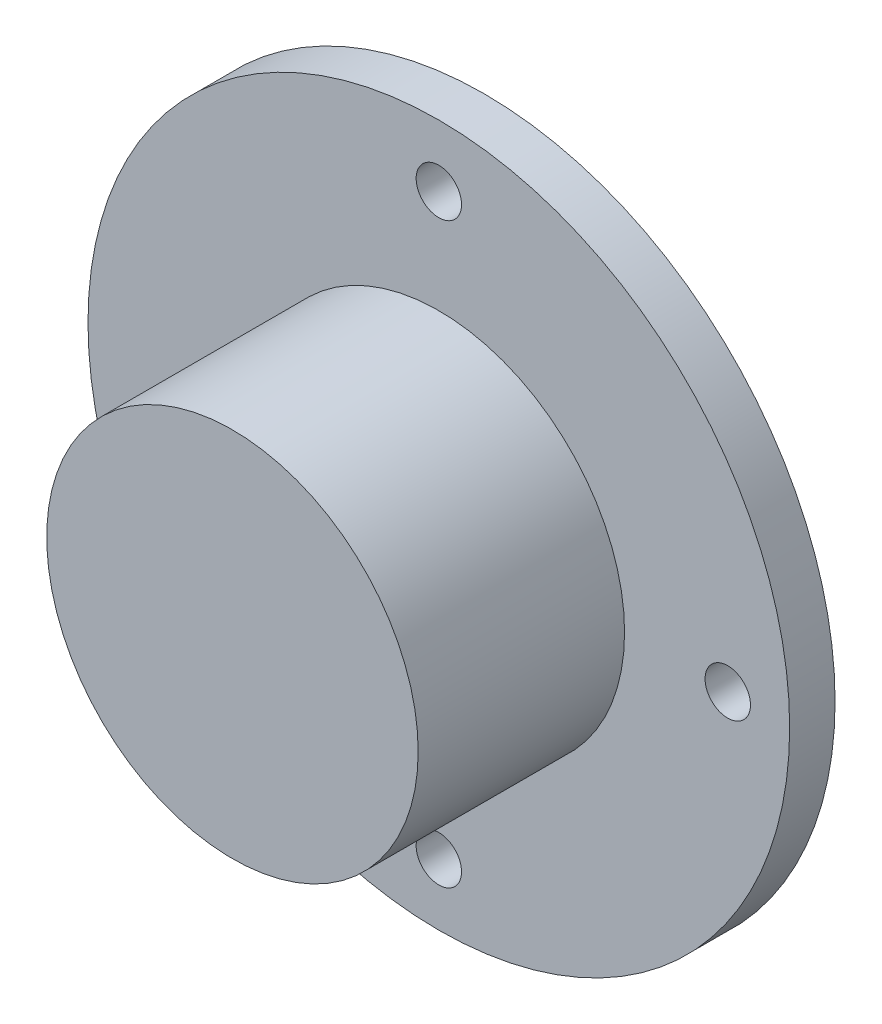
ISO-10303-21;
HEADER;
FILE_DESCRIPTION(('STEP AP214'),'2;1');
FILE_NAME('part.step','',(''),(''),'','','');
FILE_SCHEMA(('AUTOMOTIVE_DESIGN { 1 0 10303 214 1 1 1 1 }'));
ENDSEC;
DATA;
#1=APPLICATION_CONTEXT('core data for automotive mechanical design processes');
#2=APPLICATION_PROTOCOL_DEFINITION('international standard','automotive_design',2000,#1);
#3=PRODUCT_CONTEXT('',#1,'mechanical');
#4=PRODUCT('Part','Part','',(#3));
#5=PRODUCT_RELATED_PRODUCT_CATEGORY('part','',(#4));
#6=PRODUCT_DEFINITION_FORMATION('','',#4);
#7=PRODUCT_DEFINITION_CONTEXT('part definition',#1,'design');
#8=PRODUCT_DEFINITION('design','',#6,#7);
#9=PRODUCT_DEFINITION_SHAPE('','',#8);
#10=(LENGTH_UNIT() NAMED_UNIT(*) SI_UNIT(.MILLI.,.METRE.));
#11=(NAMED_UNIT(*) PLANE_ANGLE_UNIT() SI_UNIT($,.RADIAN.));
#12=(NAMED_UNIT(*) SI_UNIT($,.STERADIAN.) SOLID_ANGLE_UNIT());
#13=UNCERTAINTY_MEASURE_WITH_UNIT(LENGTH_MEASURE(1.E-05),#10,'distance_accuracy_value','');
#14=(GEOMETRIC_REPRESENTATION_CONTEXT(3) GLOBAL_UNCERTAINTY_ASSIGNED_CONTEXT((#13)) GLOBAL_UNIT_ASSIGNED_CONTEXT((#10,
#11,#12)) REPRESENTATION_CONTEXT('',''));
#15=CARTESIAN_POINT('',(0.,0.,0.));
#16=DIRECTION('',(0.,0.,1.));
#17=DIRECTION('',(1.,0.,0.));
#18=AXIS2_PLACEMENT_3D('',#15,#16,#17);
#19=CARTESIAN_POINT('',(0.,0.,2.));
#20=DIRECTION('',(0.,0.,-1.));
#21=DIRECTION('',(-1.,0.,0.));
#22=AXIS2_PLACEMENT_3D('',#19,#20,#21);
#23=CYLINDRICAL_SURFACE('',#22,17.);
#24=CARTESIAN_POINT('',(0.,0.,2.));
#25=DIRECTION('',(0.,0.,1.));
#26=DIRECTION('',(1.,0.,0.));
#27=AXIS2_PLACEMENT_3D('',#24,#25,#26);
#28=CIRCLE('',#27,17.);
#29=CARTESIAN_POINT('',(17.,0.,2.));
#30=VERTEX_POINT('',#29);
#31=EDGE_CURVE('E51',#30,#30,#28,.T.);
#32=ORIENTED_EDGE('',*,*,#31,.F.);
#33=EDGE_LOOP('',(#32));
#34=FACE_BOUND('',#33,.T.);
#35=CARTESIAN_POINT('',(0.,0.,-0.2));
#36=DIRECTION('',(0.,0.,1.));
#37=DIRECTION('',(1.,0.,0.));
#38=AXIS2_PLACEMENT_3D('',#35,#36,#37);
#39=CIRCLE('',#38,17.);
#40=CARTESIAN_POINT('',(17.,0.,-0.2));
#41=VERTEX_POINT('',#40);
#42=EDGE_CURVE('E60',#41,#41,#39,.T.);
#43=ORIENTED_EDGE('',*,*,#42,.T.);
#44=EDGE_LOOP('',(#43));
#45=FACE_BOUND('',#44,.T.);
#46=ADVANCED_FACE('F43',(#34,#45),#23,.T.);
#47=CARTESIAN_POINT('',(0.,0.,2.));
#48=DIRECTION('',(0.,0.,1.));
#49=DIRECTION('',(1.,0.,0.));
#50=AXIS2_PLACEMENT_3D('',#47,#48,#49);
#51=PLANE('',#50);
#52=CARTESIAN_POINT('',(14.,0.,2.));
#53=DIRECTION('',(0.,0.,1.));
#54=DIRECTION('',(1.,0.,0.));
#55=AXIS2_PLACEMENT_3D('',#52,#53,#54);
#56=CIRCLE('',#55,1.1);
#57=CARTESIAN_POINT('',(15.1,0.,2.));
#58=VERTEX_POINT('',#57);
#59=EDGE_CURVE('E91',#58,#58,#56,.F.);
#60=ORIENTED_EDGE('',*,*,#59,.T.);
#61=EDGE_LOOP('',(#60));
#62=FACE_BOUND('',#61,.T.);
#63=CARTESIAN_POINT('',(0.,-14.,2.));
#64=DIRECTION('',(0.,0.,1.));
#65=DIRECTION('',(1.,0.,0.));
#66=AXIS2_PLACEMENT_3D('',#63,#64,#65);
#67=CIRCLE('',#66,1.1);
#68=CARTESIAN_POINT('',(1.1,-14.,2.));
#69=VERTEX_POINT('',#68);
#70=EDGE_CURVE('E83',#69,#69,#67,.F.);
#71=ORIENTED_EDGE('',*,*,#70,.T.);
#72=EDGE_LOOP('',(#71));
#73=FACE_BOUND('',#72,.T.);
#74=CARTESIAN_POINT('',(0.,14.,2.));
#75=DIRECTION('',(0.,0.,1.));
#76=DIRECTION('',(1.,0.,0.));
#77=AXIS2_PLACEMENT_3D('',#74,#75,#76);
#78=CIRCLE('',#77,1.1);
#79=CARTESIAN_POINT('',(1.1,14.,2.));
#80=VERTEX_POINT('',#79);
#81=EDGE_CURVE('E80',#80,#80,#78,.F.);
#82=ORIENTED_EDGE('',*,*,#81,.T.);
#83=EDGE_LOOP('',(#82));
#84=FACE_BOUND('',#83,.T.);
#85=CARTESIAN_POINT('',(0.,0.,2.));
#86=DIRECTION('',(0.,0.,1.));
#87=DIRECTION('',(1.,0.,0.));
#88=AXIS2_PLACEMENT_3D('',#85,#86,#87);
#89=CIRCLE('',#88,9.);
#90=CARTESIAN_POINT('',(9.,0.,2.));
#91=VERTEX_POINT('',#90);
#92=EDGE_CURVE('E70',#91,#91,#89,.F.);
#93=ORIENTED_EDGE('',*,*,#92,.T.);
#94=EDGE_LOOP('',(#93));
#95=FACE_BOUND('',#94,.T.);
#96=ORIENTED_EDGE('',*,*,#31,.T.);
#97=EDGE_LOOP('',(#96));
#98=FACE_BOUND('',#97,.T.);
#99=ADVANCED_FACE('F127',(#62,#73,#84,#95,#98),#51,.T.);
#100=CARTESIAN_POINT('',(0.,0.,-0.2));
#101=DIRECTION('',(0.,0.,1.));
#102=DIRECTION('',(1.,0.,0.));
#103=AXIS2_PLACEMENT_3D('',#100,#101,#102);
#104=PLANE('',#103);
#105=CARTESIAN_POINT('',(14.,0.,-0.200000000000001));
#106=DIRECTION('',(0.,0.,1.));
#107=DIRECTION('',(1.,0.,0.));
#108=AXIS2_PLACEMENT_3D('',#105,#106,#107);
#109=CIRCLE('',#108,1.1);
#110=CARTESIAN_POINT('',(15.1,0.,-0.200000000000001));
#111=VERTEX_POINT('',#110);
#112=EDGE_CURVE('E46',#111,#111,#109,.F.);
#113=ORIENTED_EDGE('',*,*,#112,.F.);
#114=EDGE_LOOP('',(#113));
#115=FACE_BOUND('',#114,.T.);
#116=CARTESIAN_POINT('',(0.,-14.,-0.200000000000001));
#117=DIRECTION('',(0.,0.,1.));
#118=DIRECTION('',(1.,0.,0.));
#119=AXIS2_PLACEMENT_3D('',#116,#117,#118);
#120=CIRCLE('',#119,1.1);
#121=CARTESIAN_POINT('',(1.1,-14.,-0.200000000000001));
#122=VERTEX_POINT('',#121);
#123=EDGE_CURVE('E79',#122,#122,#120,.F.);
#124=ORIENTED_EDGE('',*,*,#123,.F.);
#125=EDGE_LOOP('',(#124));
#126=FACE_BOUND('',#125,.T.);
#127=CARTESIAN_POINT('',(0.,14.,-0.200000000000001));
#128=DIRECTION('',(0.,0.,1.));
#129=DIRECTION('',(1.,0.,0.));
#130=AXIS2_PLACEMENT_3D('',#127,#128,#129);
#131=CIRCLE('',#130,1.1);
#132=CARTESIAN_POINT('',(1.1,14.,-0.200000000000001));
#133=VERTEX_POINT('',#132);
#134=EDGE_CURVE('E74',#133,#133,#131,.F.);
#135=ORIENTED_EDGE('',*,*,#134,.F.);
#136=EDGE_LOOP('',(#135));
#137=FACE_BOUND('',#136,.T.);
#138=ORIENTED_EDGE('',*,*,#42,.F.);
#139=EDGE_LOOP('',(#138));
#140=FACE_BOUND('',#139,.T.);
#141=CARTESIAN_POINT('',(0.,0.,-0.2));
#142=DIRECTION('',(0.,0.,1.));
#143=DIRECTION('',(1.,0.,0.));
#144=AXIS2_PLACEMENT_3D('',#141,#142,#143);
#145=CIRCLE('',#144,11.2);
#146=CARTESIAN_POINT('',(11.2,0.,-0.2));
#147=VERTEX_POINT('',#146);
#148=EDGE_CURVE('E64',#147,#147,#145,.T.);
#149=ORIENTED_EDGE('',*,*,#148,.T.);
#150=EDGE_LOOP('',(#149));
#151=FACE_BOUND('',#150,.T.);
#152=ADVANCED_FACE('F135',(#115,#126,#137,#140,#151),#104,.F.);
#153=CARTESIAN_POINT('',(0.,0.,0.));
#154=DIRECTION('',(0.,0.,-1.));
#155=DIRECTION('',(-1.,0.,0.));
#156=AXIS2_PLACEMENT_3D('',#153,#154,#155);
#157=CYLINDRICAL_SURFACE('',#156,11.2);
#158=CARTESIAN_POINT('',(0.,0.,0.));
#159=DIRECTION('',(0.,0.,1.));
#160=DIRECTION('',(1.,0.,0.));
#161=AXIS2_PLACEMENT_3D('',#158,#159,#160);
#162=CIRCLE('',#161,11.2);
#163=CARTESIAN_POINT('',(11.2,0.,0.));
#164=VERTEX_POINT('',#163);
#165=EDGE_CURVE('E10',#164,#164,#162,.T.);
#166=ORIENTED_EDGE('',*,*,#165,.T.);
#167=EDGE_LOOP('',(#166));
#168=FACE_BOUND('',#167,.T.);
#169=ORIENTED_EDGE('',*,*,#148,.F.);
#170=EDGE_LOOP('',(#169));
#171=FACE_BOUND('',#170,.T.);
#172=ADVANCED_FACE('F143',(#168,#171),#157,.F.);
#173=CARTESIAN_POINT('',(0.,0.,0.));
#174=DIRECTION('',(0.,0.,1.));
#175=DIRECTION('',(1.,0.,0.));
#176=AXIS2_PLACEMENT_3D('',#173,#174,#175);
#177=PLANE('',#176);
#178=CARTESIAN_POINT('',(0.,0.,0.));
#179=DIRECTION('',(0.,0.,1.));
#180=DIRECTION('',(1.,0.,0.));
#181=AXIS2_PLACEMENT_3D('',#178,#179,#180);
#182=CIRCLE('',#181,7.);
#183=CARTESIAN_POINT('',(7.,0.,0.));
#184=VERTEX_POINT('',#183);
#185=EDGE_CURVE('E100',#184,#184,#182,.T.);
#186=ORIENTED_EDGE('',*,*,#185,.T.);
#187=EDGE_LOOP('',(#186));
#188=FACE_BOUND('',#187,.T.);
#189=ORIENTED_EDGE('',*,*,#165,.F.);
#190=EDGE_LOOP('',(#189));
#191=FACE_BOUND('',#190,.T.);
#192=ADVANCED_FACE('F104',(#188,#191),#177,.F.);
#193=CARTESIAN_POINT('',(0.,0.,12.));
#194=DIRECTION('',(0.,0.,-1.));
#195=DIRECTION('',(-1.,0.,0.));
#196=AXIS2_PLACEMENT_3D('',#193,#194,#195);
#197=CYLINDRICAL_SURFACE('',#196,9.);
#198=ORIENTED_EDGE('',*,*,#92,.F.);
#199=EDGE_LOOP('',(#198));
#200=FACE_BOUND('',#199,.T.);
#201=CARTESIAN_POINT('',(0.,0.,12.));
#202=DIRECTION('',(0.,0.,1.));
#203=DIRECTION('',(1.,0.,0.));
#204=AXIS2_PLACEMENT_3D('',#201,#202,#203);
#205=CIRCLE('',#204,9.);
#206=CARTESIAN_POINT('',(9.,0.,12.));
#207=VERTEX_POINT('',#206);
#208=EDGE_CURVE('E62',#207,#207,#205,.T.);
#209=ORIENTED_EDGE('',*,*,#208,.F.);
#210=EDGE_LOOP('',(#209));
#211=FACE_BOUND('',#210,.T.);
#212=ADVANCED_FACE('F125',(#200,#211),#197,.T.);
#213=CARTESIAN_POINT('',(0.,0.,12.));
#214=DIRECTION('',(0.,0.,1.));
#215=DIRECTION('',(1.,0.,0.));
#216=AXIS2_PLACEMENT_3D('',#213,#214,#215);
#217=PLANE('',#216);
#218=ORIENTED_EDGE('',*,*,#208,.T.);
#219=EDGE_LOOP('',(#218));
#220=FACE_BOUND('',#219,.T.);
#221=ADVANCED_FACE('F112',(#220),#217,.T.);
#222=CARTESIAN_POINT('',(0.,0.,9.));
#223=DIRECTION('',(0.,0.,-1.));
#224=DIRECTION('',(-1.,0.,0.));
#225=AXIS2_PLACEMENT_3D('',#222,#223,#224);
#226=CYLINDRICAL_SURFACE('',#225,7.);
#227=CARTESIAN_POINT('',(0.,0.,9.));
#228=DIRECTION('',(0.,0.,1.));
#229=DIRECTION('',(1.,0.,0.));
#230=AXIS2_PLACEMENT_3D('',#227,#228,#229);
#231=CIRCLE('',#230,7.);
#232=CARTESIAN_POINT('',(7.,0.,9.));
#233=VERTEX_POINT('',#232);
#234=EDGE_CURVE('E98',#233,#233,#231,.T.);
#235=ORIENTED_EDGE('',*,*,#234,.T.);
#236=EDGE_LOOP('',(#235));
#237=FACE_BOUND('',#236,.T.);
#238=ORIENTED_EDGE('',*,*,#185,.F.);
#239=EDGE_LOOP('',(#238));
#240=FACE_BOUND('',#239,.T.);
#241=ADVANCED_FACE('F107',(#237,#240),#226,.F.);
#242=CARTESIAN_POINT('',(0.,0.,9.));
#243=DIRECTION('',(0.,0.,1.));
#244=DIRECTION('',(1.,0.,0.));
#245=AXIS2_PLACEMENT_3D('',#242,#243,#244);
#246=PLANE('',#245);
#247=ORIENTED_EDGE('',*,*,#234,.F.);
#248=EDGE_LOOP('',(#247));
#249=FACE_BOUND('',#248,.T.);
#250=ADVANCED_FACE('F109',(#249),#246,.F.);
#251=CARTESIAN_POINT('',(0.,14.,12.));
#252=DIRECTION('',(0.,0.,-1.));
#253=DIRECTION('',(-1.,0.,0.));
#254=AXIS2_PLACEMENT_3D('',#251,#252,#253);
#255=CYLINDRICAL_SURFACE('',#254,1.1);
#256=ORIENTED_EDGE('',*,*,#81,.F.);
#257=EDGE_LOOP('',(#256));
#258=FACE_BOUND('',#257,.T.);
#259=ORIENTED_EDGE('',*,*,#134,.T.);
#260=EDGE_LOOP('',(#259));
#261=FACE_BOUND('',#260,.T.);
#262=ADVANCED_FACE('F119',(#258,#261),#255,.F.);
#263=CARTESIAN_POINT('',(0.,-14.,12.));
#264=DIRECTION('',(0.,0.,-1.));
#265=DIRECTION('',(-1.,0.,0.));
#266=AXIS2_PLACEMENT_3D('',#263,#264,#265);
#267=CYLINDRICAL_SURFACE('',#266,1.1);
#268=ORIENTED_EDGE('',*,*,#70,.F.);
#269=EDGE_LOOP('',(#268));
#270=FACE_BOUND('',#269,.T.);
#271=ORIENTED_EDGE('',*,*,#123,.T.);
#272=EDGE_LOOP('',(#271));
#273=FACE_BOUND('',#272,.T.);
#274=ADVANCED_FACE('F204',(#270,#273),#267,.F.);
#275=CARTESIAN_POINT('',(14.,0.,12.));
#276=DIRECTION('',(0.,0.,-1.));
#277=DIRECTION('',(-1.,0.,0.));
#278=AXIS2_PLACEMENT_3D('',#275,#276,#277);
#279=CYLINDRICAL_SURFACE('',#278,1.1);
#280=ORIENTED_EDGE('',*,*,#59,.F.);
#281=EDGE_LOOP('',(#280));
#282=FACE_BOUND('',#281,.T.);
#283=ORIENTED_EDGE('',*,*,#112,.T.);
#284=EDGE_LOOP('',(#283));
#285=FACE_BOUND('',#284,.T.);
#286=ADVANCED_FACE('F213',(#282,#285),#279,.F.);
#287=CLOSED_SHELL('',(#46,#99,#152,#172,#192,#212,#221,#241,#250,#262,#274,#286));
#288=MANIFOLD_SOLID_BREP('B2',#287);
#289=ADVANCED_BREP_SHAPE_REPRESENTATION('',(#18,#288),#14);
#290=SHAPE_DEFINITION_REPRESENTATION(#9,#289);
ENDSEC;
END-ISO-10303-21;
